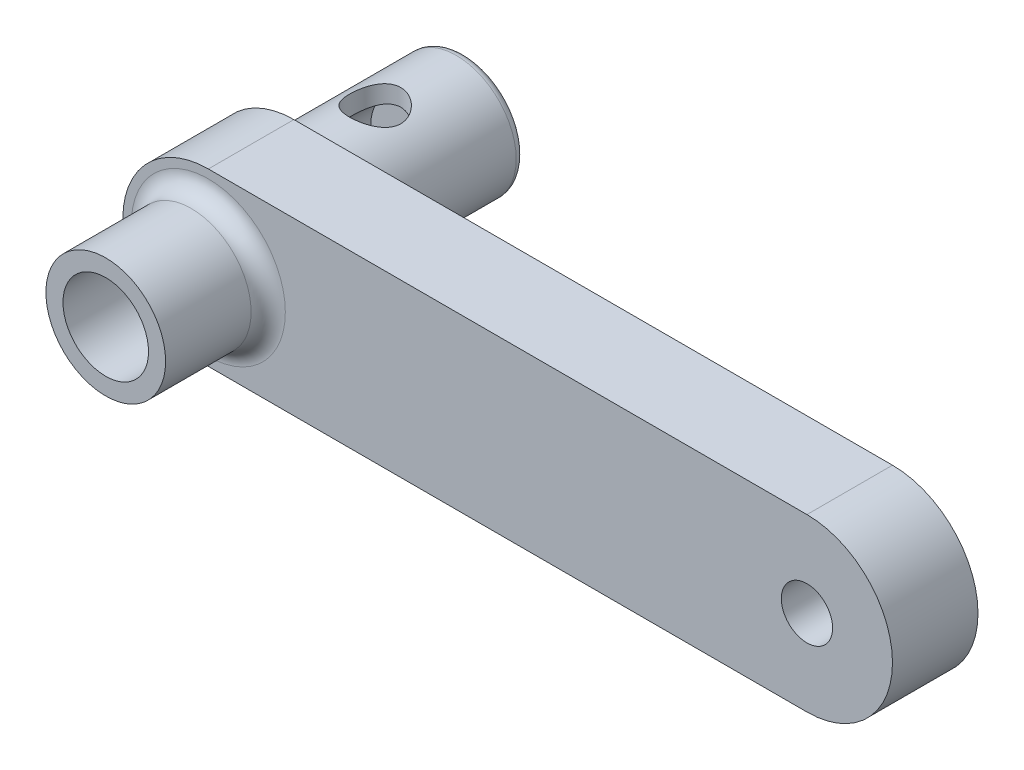
ISO-10303-21;
HEADER;
FILE_DESCRIPTION(('STEP AP214'),'2;1');
FILE_NAME('part.step','',(''),(''),'','','');
FILE_SCHEMA(('AUTOMOTIVE_DESIGN { 1 0 10303 214 1 1 1 1 }'));
ENDSEC;
DATA;
#1=APPLICATION_CONTEXT('core data for automotive mechanical design processes');
#2=APPLICATION_PROTOCOL_DEFINITION('international standard','automotive_design',2000,#1);
#3=PRODUCT_CONTEXT('',#1,'mechanical');
#4=PRODUCT('Part','Part','',(#3));
#5=PRODUCT_RELATED_PRODUCT_CATEGORY('part','',(#4));
#6=PRODUCT_DEFINITION_FORMATION('','',#4);
#7=PRODUCT_DEFINITION_CONTEXT('part definition',#1,'design');
#8=PRODUCT_DEFINITION('design','',#6,#7);
#9=PRODUCT_DEFINITION_SHAPE('','',#8);
#10=(LENGTH_UNIT() NAMED_UNIT(*) SI_UNIT(.MILLI.,.METRE.));
#11=(NAMED_UNIT(*) PLANE_ANGLE_UNIT() SI_UNIT($,.RADIAN.));
#12=(NAMED_UNIT(*) SI_UNIT($,.STERADIAN.) SOLID_ANGLE_UNIT());
#13=UNCERTAINTY_MEASURE_WITH_UNIT(LENGTH_MEASURE(1.E-05),#10,'distance_accuracy_value','');
#14=(GEOMETRIC_REPRESENTATION_CONTEXT(3) GLOBAL_UNCERTAINTY_ASSIGNED_CONTEXT((#13)) GLOBAL_UNIT_ASSIGNED_CONTEXT((#10,
#11,#12)) REPRESENTATION_CONTEXT('',''));
#15=CARTESIAN_POINT('',(0.,0.,0.));
#16=DIRECTION('',(0.,0.,1.));
#17=DIRECTION('',(1.,0.,0.));
#18=AXIS2_PLACEMENT_3D('',#15,#16,#17);
#19=CARTESIAN_POINT('',(-17.5,0.,-0.999999999999999));
#20=DIRECTION('',(0.,0.,1.));
#21=DIRECTION('',(1.,0.,0.));
#22=AXIS2_PLACEMENT_3D('',#19,#20,#21);
#23=TOROIDAL_SURFACE('',#22,4.5,1.);
#24=CARTESIAN_POINT('',(-17.5,0.,0.));
#25=DIRECTION('',(0.,0.,1.));
#26=DIRECTION('',(1.,0.,0.));
#27=AXIS2_PLACEMENT_3D('',#24,#25,#26);
#28=CIRCLE('',#27,4.5);
#29=CARTESIAN_POINT('',(-13.,0.,0.));
#30=VERTEX_POINT('',#29);
#31=EDGE_CURVE('E41',#30,#30,#28,.T.);
#32=ORIENTED_EDGE('',*,*,#31,.F.);
#33=EDGE_LOOP('',(#32));
#34=FACE_BOUND('',#33,.T.);
#35=CARTESIAN_POINT('',(-17.5,0.,-0.999999999999999));
#36=DIRECTION('',(0.,0.,1.));
#37=DIRECTION('',(1.,0.,0.));
#38=AXIS2_PLACEMENT_3D('',#35,#36,#37);
#39=CIRCLE('',#38,3.5);
#40=CARTESIAN_POINT('',(-14.,0.,-0.999999999999999));
#41=VERTEX_POINT('',#40);
#42=EDGE_CURVE('E11',#41,#41,#39,.F.);
#43=ORIENTED_EDGE('',*,*,#42,.F.);
#44=EDGE_LOOP('',(#43));
#45=FACE_BOUND('',#44,.T.);
#46=ADVANCED_FACE('F33',(#34,#45),#23,.F.);
#47=CARTESIAN_POINT('',(-17.5,0.,6.));
#48=DIRECTION('',(0.,0.,1.));
#49=DIRECTION('',(1.,0.,0.));
#50=AXIS2_PLACEMENT_3D('',#47,#48,#49);
#51=TOROIDAL_SURFACE('',#50,4.5,1.);
#52=CARTESIAN_POINT('',(-17.5,0.,6.));
#53=DIRECTION('',(0.,0.,1.));
#54=DIRECTION('',(1.,0.,0.));
#55=AXIS2_PLACEMENT_3D('',#52,#53,#54);
#56=CIRCLE('',#55,3.5);
#57=CARTESIAN_POINT('',(-14.,0.,6.));
#58=VERTEX_POINT('',#57);
#59=EDGE_CURVE('E116',#58,#58,#56,.T.);
#60=ORIENTED_EDGE('',*,*,#59,.F.);
#61=EDGE_LOOP('',(#60));
#62=FACE_BOUND('',#61,.T.);
#63=CARTESIAN_POINT('',(-17.5,0.,5.));
#64=DIRECTION('',(0.,0.,1.));
#65=DIRECTION('',(1.,0.,0.));
#66=AXIS2_PLACEMENT_3D('',#63,#64,#65);
#67=CIRCLE('',#66,4.5);
#68=CARTESIAN_POINT('',(-13.,0.,5.));
#69=VERTEX_POINT('',#68);
#70=EDGE_CURVE('E203',#69,#69,#67,.F.);
#71=ORIENTED_EDGE('',*,*,#70,.F.);
#72=EDGE_LOOP('',(#71));
#73=FACE_BOUND('',#72,.T.);
#74=ADVANCED_FACE('F174',(#62,#73),#51,.F.);
#75=CARTESIAN_POINT('',(-17.5,0.,5.));
#76=DIRECTION('',(0.,0.,1.));
#77=DIRECTION('',(1.,0.,0.));
#78=AXIS2_PLACEMENT_3D('',#75,#76,#77);
#79=PLANE('',#78);
#80=ORIENTED_EDGE('',*,*,#70,.T.);
#81=EDGE_LOOP('',(#80));
#82=FACE_BOUND('',#81,.T.);
#83=CARTESIAN_POINT('',(17.5,0.,5.));
#84=DIRECTION('',(0.,0.,1.));
#85=DIRECTION('',(1.,0.,0.));
#86=AXIS2_PLACEMENT_3D('',#83,#84,#85);
#87=CIRCLE('',#86,1.5);
#88=CARTESIAN_POINT('',(19.,0.,5.));
#89=VERTEX_POINT('',#88);
#90=EDGE_CURVE('E103',#89,#89,#87,.T.);
#91=ORIENTED_EDGE('',*,*,#90,.F.);
#92=EDGE_LOOP('',(#91));
#93=FACE_BOUND('',#92,.T.);
#94=CARTESIAN_POINT('',(-17.5,0.,5.));
#95=DIRECTION('',(0.,0.,1.));
#96=DIRECTION('',(1.,0.,0.));
#97=AXIS2_PLACEMENT_3D('',#94,#95,#96);
#98=CIRCLE('',#97,5.);
#99=CARTESIAN_POINT('',(-17.5,5.,5.));
#100=VERTEX_POINT('',#99);
#101=CARTESIAN_POINT('',(-17.5,-5.,5.));
#102=VERTEX_POINT('',#101);
#103=EDGE_CURVE('E85',#100,#102,#98,.T.);
#104=ORIENTED_EDGE('',*,*,#103,.T.);
#105=DIRECTION('',(1.,0.,0.));
#106=VECTOR('',#105,1.);
#107=CARTESIAN_POINT('',(-17.5,-5.,5.));
#108=LINE('',#107,#106);
#109=CARTESIAN_POINT('',(17.5,-5.,5.));
#110=VERTEX_POINT('',#109);
#111=EDGE_CURVE('E80',#102,#110,#108,.T.);
#112=ORIENTED_EDGE('',*,*,#111,.T.);
#113=CARTESIAN_POINT('',(17.5,0.,5.));
#114=DIRECTION('',(0.,0.,1.));
#115=DIRECTION('',(1.,0.,0.));
#116=AXIS2_PLACEMENT_3D('',#113,#114,#115);
#117=CIRCLE('',#116,5.);
#118=CARTESIAN_POINT('',(17.5,5.00000000000001,5.));
#119=VERTEX_POINT('',#118);
#120=EDGE_CURVE('E83',#110,#119,#117,.T.);
#121=ORIENTED_EDGE('',*,*,#120,.T.);
#122=DIRECTION('',(-1.,0.,0.));
#123=VECTOR('',#122,1.);
#124=CARTESIAN_POINT('',(-17.5,5.,5.));
#125=LINE('',#124,#123);
#126=EDGE_CURVE('E49',#119,#100,#125,.T.);
#127=ORIENTED_EDGE('',*,*,#126,.T.);
#128=EDGE_LOOP('',(#104,#112,#121,#127));
#129=FACE_BOUND('',#128,.T.);
#130=ADVANCED_FACE('F81',(#82,#93,#129),#79,.T.);
#131=CARTESIAN_POINT('',(-17.5,0.,5.));
#132=DIRECTION('',(0.,0.,-1.));
#133=DIRECTION('',(-1.,0.,0.));
#134=AXIS2_PLACEMENT_3D('',#131,#132,#133);
#135=CYLINDRICAL_SURFACE('',#134,2.5);
#136=CARTESIAN_POINT('',(-17.5,-2.5,-3.25));
#137=CARTESIAN_POINT('',(-17.423270166538,-2.49999625789732,-3.25000409100988));
#138=CARTESIAN_POINT('',(-17.3464176793558,-2.4964290461501,-3.25592867092626));
#139=CARTESIAN_POINT('',(-17.1950244904693,-2.48249903608568,-3.27932431951533));
#140=CARTESIAN_POINT('',(-17.120489965404,-2.47211948032719,-3.29682386185422));
#141=CARTESIAN_POINT('',(-16.9762481722092,-2.44561558054488,-3.34238636116686));
#142=CARTESIAN_POINT('',(-16.9065189717734,-2.42951973272944,-3.37039695816316));
#143=CARTESIAN_POINT('',(-16.7729696817853,-2.39295367626407,-3.43586033314103));
#144=CARTESIAN_POINT('',(-16.7091481305836,-2.37248455380255,-3.47331076696875));
#145=CARTESIAN_POINT('',(-16.5837007210007,-2.32705360719088,-3.55977482670858));
#146=CARTESIAN_POINT('',(-16.5226159799186,-2.30186792195985,-3.60945369535139));
#147=CARTESIAN_POINT('',(-16.4091172958811,-2.25030439279634,-3.71746720382827));
#148=CARTESIAN_POINT('',(-16.3567146505189,-2.22392505153571,-3.77581293718732));
#149=CARTESIAN_POINT('',(-16.2555500323703,-2.1691106699591,-3.90792351049673));
#150=CARTESIAN_POINT('',(-16.2080223362119,-2.14082017703649,-3.98270177098129));
#151=CARTESIAN_POINT('',(-16.126385622351,-2.08938301412124,-4.14084657324311));
#152=CARTESIAN_POINT('',(-16.0922548266484,-2.06622802273937,-4.22419889624757));
#153=CARTESIAN_POINT('',(-16.0455939828578,-2.0335462966093,-4.37659645065324));
#154=CARTESIAN_POINT('',(-16.0298380275317,-2.02207883137591,-4.44423599861032));
#155=CARTESIAN_POINT('',(-16.0078382765953,-2.00590308295503,-4.58180371583036));
#156=CARTESIAN_POINT('',(-16.0015826544316,-2.00118639643759,-4.65172892875449));
#157=CARTESIAN_POINT('',(-15.9989449120399,-1.99920922463856,-4.79201149421733));
#158=CARTESIAN_POINT('',(-16.0025821659158,-2.00196337012718,-4.8623694250932));
#159=CARTESIAN_POINT('',(-16.0195393952117,-2.01453261443741,-5.00127877542759));
#160=CARTESIAN_POINT('',(-16.032866653799,-2.02435302432226,-5.06982879584744));
#161=CARTESIAN_POINT('',(-16.0682607811821,-2.04953186944258,-5.2025302421281));
#162=CARTESIAN_POINT('',(-16.0902125133391,-2.06481711652537,-5.26672705392448));
#163=CARTESIAN_POINT('',(-16.1420493822916,-2.09927051350828,-5.39069499092812));
#164=CARTESIAN_POINT('',(-16.171937427403,-2.11844008623465,-5.45046448342392));
#165=CARTESIAN_POINT('',(-16.2448201681542,-2.16255327268985,-5.5749840971228));
#166=CARTESIAN_POINT('',(-16.2891927560228,-2.18792043372992,-5.63877809295493));
#167=CARTESIAN_POINT('',(-16.38708907216,-2.23930599764381,-5.75867648366702));
#168=CARTESIAN_POINT('',(-16.4406215489942,-2.26532500262149,-5.8147734339765));
#169=CARTESIAN_POINT('',(-16.564188165617,-2.31935504958317,-5.92561298182176));
#170=CARTESIAN_POINT('',(-16.635482317295,-2.34713836268532,-5.97907730601599));
#171=CARTESIAN_POINT('',(-16.787723949541,-2.39772428433981,-6.07312204719791));
#172=CARTESIAN_POINT('',(-16.8686662360564,-2.42052955425515,-6.11370935378995));
#173=CARTESIAN_POINT('',(-17.0328024147318,-2.45730392066151,-6.1779321827959));
#174=CARTESIAN_POINT('',(-17.1155323758264,-2.47173957439704,-6.20247535571591));
#175=CARTESIAN_POINT('',(-17.2849521048554,-2.49218842813551,-6.23701119740538));
#176=CARTESIAN_POINT('',(-17.3716369943387,-2.49821172952738,-6.24702131775358));
#177=CARTESIAN_POINT('',(-17.5337146143774,-2.5009057037461,-6.25150784767831));
#178=CARTESIAN_POINT('',(-17.6090424734187,-2.49873521714286,-6.24790885508517));
#179=CARTESIAN_POINT('',(-17.7578294019861,-2.48778712087048,-6.22957414692808));
#180=CARTESIAN_POINT('',(-17.8312885093761,-2.47900964518037,-6.21483865719419));
#181=CARTESIAN_POINT('',(-17.9725749321576,-2.4559479244219,-6.17545656718754));
#182=CARTESIAN_POINT('',(-18.0404957509285,-2.44180275662555,-6.15105965092653));
#183=CARTESIAN_POINT('',(-18.1712657490873,-2.40913880862845,-6.09332262363473));
#184=CARTESIAN_POINT('',(-18.2341139249639,-2.39061916586511,-6.05998074865333));
#185=CARTESIAN_POINT('',(-18.3600062628239,-2.3484549623736,-5.9814430207913));
#186=CARTESIAN_POINT('',(-18.4223941504568,-2.3244780273988,-5.93537617092161));
#187=CARTESIAN_POINT('',(-18.5390260313101,-2.27474265574732,-5.83460860651138));
#188=CARTESIAN_POINT('',(-18.5932604027374,-2.2489821658636,-5.77989784514747));
#189=CARTESIAN_POINT('',(-18.6993199673558,-2.19445423909891,-5.65508960996285));
#190=CARTESIAN_POINT('',(-18.7499101963092,-2.16573241746291,-5.5839161145345));
#191=CARTESIAN_POINT('',(-18.8384523891567,-2.1121618206671,-5.4327839754318));
#192=CARTESIAN_POINT('',(-18.8764176676978,-2.0873089799769,-5.35283470610722));
#193=CARTESIAN_POINT('',(-18.9314257879578,-2.04984909240519,-5.20375697769331));
#194=CARTESIAN_POINT('',(-18.9512162533619,-2.03575659328728,-5.13601968764141));
#195=CARTESIAN_POINT('',(-18.9811366390597,-2.01409605743544,-4.9974679219199));
#196=CARTESIAN_POINT('',(-18.9912799529763,-2.00651897642721,-4.92665785567217));
#197=CARTESIAN_POINT('',(-19.0013413041663,-1.99900446616267,-4.78362305240297));
#198=CARTESIAN_POINT('',(-19.0012208910787,-1.99909576445937,-4.71139400931296));
#199=CARTESIAN_POINT('',(-18.9906647295933,-2.0069771789285,-4.56810556439054));
#200=CARTESIAN_POINT('',(-18.9802233721576,-2.0147714813882,-4.49704681991941));
#201=CARTESIAN_POINT('',(-18.9504017414891,-2.0363318524298,-4.36151158242782));
#202=CARTESIAN_POINT('',(-18.9314763684535,-2.0497921180558,-4.29688290569313));
#203=CARTESIAN_POINT('',(-18.8856324207699,-2.08105501960151,-4.17166274552579));
#204=CARTESIAN_POINT('',(-18.8587108358848,-2.09885929040482,-4.11107279303945));
#205=CARTESIAN_POINT('',(-18.7928924555573,-2.14012990550916,-3.98568014277922));
#206=CARTESIAN_POINT('',(-18.7527916767575,-2.16404587582639,-3.92165889614569));
#207=CARTESIAN_POINT('',(-18.6637569838908,-2.21320127030768,-3.80061992738271));
#208=CARTESIAN_POINT('',(-18.614815796078,-2.23844177205021,-3.74360803784744));
#209=CARTESIAN_POINT('',(-18.5000977742573,-2.29225690291476,-3.62864905086833));
#210=CARTESIAN_POINT('',(-18.4328768193139,-2.32070308663658,-3.57206892510381));
#211=CARTESIAN_POINT('',(-18.2884624344456,-2.37365428872367,-3.47090214413669));
#212=CARTESIAN_POINT('',(-18.2112654445015,-2.39815789310936,-3.42631978801521));
#213=CARTESIAN_POINT('',(-18.0511252308015,-2.43985578654394,-3.35221419242626));
#214=CARTESIAN_POINT('',(-17.9684300869572,-2.45725077479787,-3.32227193507317));
#215=CARTESIAN_POINT('',(-17.7979733061188,-2.48366273001246,-3.27727530478902));
#216=CARTESIAN_POINT('',(-17.7102320996486,-2.49271125871485,-3.26216483214301));
#217=CARTESIAN_POINT('',(-17.6015580969175,-2.49802001168187,-3.25330254529134));
#218=CARTESIAN_POINT('',(-17.5812762590283,-2.49876114656362,-3.2520655826939));
#219=CARTESIAN_POINT('',(-17.5406658206871,-2.49975164517367,-3.25041375362914));
#220=CARTESIAN_POINT('',(-17.5203372186376,-2.50000099184316,-3.2499989156791));
#221=CARTESIAN_POINT('',(-17.5,-2.5,-3.25));
#222=B_SPLINE_CURVE_WITH_KNOTS('',3,(#136,#137,#138,#139,#140,#141,#142,#143,#144,#145,#146,
#147,#148,#149,#150,#151,#152,#153,#154,#155,#156,#157,#158,#159,#160,#161,#162,#163,#164,#165,
#166,#167,#168,#169,#170,#171,#172,#173,#174,#175,#176,#177,#178,#179,#180,#181,#182,#183,#184,
#185,#186,#187,#188,#189,#190,#191,#192,#193,#194,#195,#196,#197,#198,#199,#200,#201,#202,#203,
#204,#205,#206,#207,#208,#209,#210,#211,#212,#213,#214,#215,#216,#217,#218,#219,#220,#221),
.UNSPECIFIED.,.T.,.F.,(4,2,2,2,2,2,2,2,2,2,2,2,2,2,2,2,2,2,2,2,2,2,2,2,2,2,2,2,2,2,2,2,2,2,2,2,
2,2,2,2,2,2,4),(0.,0.23010223754865,0.460772627520013,0.690308884600013,0.919788197992274,
1.16681590732472,1.41416257934801,1.69183813189807,1.96906040692092,2.17933829855633,
2.38935420916578,2.59978170870726,2.81036753273872,3.01823267593207,3.22617409809868,
3.47046995225163,3.71500044803674,3.99360957884691,4.27206939275324,4.53296790696559,
4.79355286918236,5.01875602722426,5.24395461863455,5.46367785689772,5.68344445659025,
5.92601365818362,6.16886690081836,6.44336762428009,6.71757792616456,6.93257787314692,
7.14727888733318,7.36278425777433,7.57840681155725,7.78364098331141,7.98895251523034,
8.22578610052286,8.46281544370207,8.73854311775518,9.01436946031984,9.28175654462677,
9.54812832184448,9.60911473335176,9.6701032602764),.UNSPECIFIED.);
#223=CARTESIAN_POINT('',(-17.5,-2.5,-3.25));
#224=VERTEX_POINT('',#223);
#225=EDGE_CURVE('E158',#224,#224,#222,.T.);
#226=ORIENTED_EDGE('',*,*,#225,.F.);
#227=EDGE_LOOP('',(#226));
#228=FACE_BOUND('',#227,.T.);
#229=CARTESIAN_POINT('',(-17.5,2.5,-3.25));
#230=CARTESIAN_POINT('',(-17.576729833462,2.49999625789732,-3.25000409100988));
#231=CARTESIAN_POINT('',(-17.6535823206442,2.4964290461501,-3.25592867092626));
#232=CARTESIAN_POINT('',(-17.8049755095307,2.48249903608568,-3.27932431951533));
#233=CARTESIAN_POINT('',(-17.879510034596,2.47211948032719,-3.29682386185422));
#234=CARTESIAN_POINT('',(-18.0237518277908,2.44561558054488,-3.34238636116686));
#235=CARTESIAN_POINT('',(-18.0934810282266,2.42951973272944,-3.37039695816316));
#236=CARTESIAN_POINT('',(-18.2270303182147,2.39295367626407,-3.43586033314103));
#237=CARTESIAN_POINT('',(-18.2908518694164,2.37248455380255,-3.47331076696875));
#238=CARTESIAN_POINT('',(-18.4162992789993,2.32705360719088,-3.55977482670858));
#239=CARTESIAN_POINT('',(-18.4773840200814,2.30186792195985,-3.60945369535139));
#240=CARTESIAN_POINT('',(-18.5908827041189,2.25030439279634,-3.71746720382827));
#241=CARTESIAN_POINT('',(-18.6432853494811,2.22392505153571,-3.77581293718732));
#242=CARTESIAN_POINT('',(-18.7444499676297,2.1691106699591,-3.90792351049673));
#243=CARTESIAN_POINT('',(-18.7919776637881,2.14082017703649,-3.98270177098129));
#244=CARTESIAN_POINT('',(-18.873614377649,2.08938301412124,-4.14084657324311));
#245=CARTESIAN_POINT('',(-18.9077451733516,2.06622802273937,-4.22419889624757));
#246=CARTESIAN_POINT('',(-18.9544060171422,2.0335462966093,-4.37659645065324));
#247=CARTESIAN_POINT('',(-18.9701619724683,2.02207883137591,-4.44423599861032));
#248=CARTESIAN_POINT('',(-18.9921617234047,2.00590308295503,-4.58180371583036));
#249=CARTESIAN_POINT('',(-18.9984173455684,2.00118639643759,-4.65172892875449));
#250=CARTESIAN_POINT('',(-19.0010550879601,1.99920922463856,-4.79201149421733));
#251=CARTESIAN_POINT('',(-18.9974178340842,2.00196337012718,-4.8623694250932));
#252=CARTESIAN_POINT('',(-18.9804606047883,2.01453261443741,-5.00127877542759));
#253=CARTESIAN_POINT('',(-18.967133346201,2.02435302432226,-5.06982879584744));
#254=CARTESIAN_POINT('',(-18.9317392188179,2.04953186944258,-5.2025302421281));
#255=CARTESIAN_POINT('',(-18.9097874866609,2.06481711652537,-5.26672705392448));
#256=CARTESIAN_POINT('',(-18.8579506177084,2.09927051350828,-5.39069499092812));
#257=CARTESIAN_POINT('',(-18.828062572597,2.11844008623465,-5.45046448342392));
#258=CARTESIAN_POINT('',(-18.7551798318458,2.16255327268985,-5.5749840971228));
#259=CARTESIAN_POINT('',(-18.7108072439772,2.18792043372992,-5.63877809295493));
#260=CARTESIAN_POINT('',(-18.61291092784,2.23930599764381,-5.75867648366702));
#261=CARTESIAN_POINT('',(-18.5593784510058,2.26532500262149,-5.8147734339765));
#262=CARTESIAN_POINT('',(-18.435811834383,2.31935504958317,-5.92561298182176));
#263=CARTESIAN_POINT('',(-18.364517682705,2.34713836268532,-5.97907730601599));
#264=CARTESIAN_POINT('',(-18.212276050459,2.3977242843398,-6.07312204719791));
#265=CARTESIAN_POINT('',(-18.1313337639436,2.42052955425515,-6.11370935378995));
#266=CARTESIAN_POINT('',(-17.9671975852682,2.45730392066151,-6.1779321827959));
#267=CARTESIAN_POINT('',(-17.8844676241736,2.47173957439704,-6.20247535571591));
#268=CARTESIAN_POINT('',(-17.7150478951446,2.49218842813551,-6.23701119740538));
#269=CARTESIAN_POINT('',(-17.6283630056613,2.49821172952738,-6.24702131775358));
#270=CARTESIAN_POINT('',(-17.4662853856226,2.5009057037461,-6.25150784767831));
#271=CARTESIAN_POINT('',(-17.3909575265813,2.49873521714286,-6.24790885508517));
#272=CARTESIAN_POINT('',(-17.2421705980139,2.48778712087048,-6.22957414692808));
#273=CARTESIAN_POINT('',(-17.1687114906239,2.47900964518037,-6.21483865719419));
#274=CARTESIAN_POINT('',(-17.0274250678424,2.4559479244219,-6.17545656718754));
#275=CARTESIAN_POINT('',(-16.9595042490715,2.44180275662555,-6.15105965092653));
#276=CARTESIAN_POINT('',(-16.8287342509127,2.40913880862845,-6.09332262363473));
#277=CARTESIAN_POINT('',(-16.7658860750361,2.39061916586511,-6.05998074865333));
#278=CARTESIAN_POINT('',(-16.6399937371761,2.3484549623736,-5.9814430207913));
#279=CARTESIAN_POINT('',(-16.5776058495432,2.3244780273988,-5.93537617092161));
#280=CARTESIAN_POINT('',(-16.4609739686899,2.27474265574732,-5.83460860651138));
#281=CARTESIAN_POINT('',(-16.4067395972626,2.2489821658636,-5.77989784514747));
#282=CARTESIAN_POINT('',(-16.3006800326442,2.19445423909891,-5.65508960996285));
#283=CARTESIAN_POINT('',(-16.2500898036909,2.16573241746291,-5.5839161145345));
#284=CARTESIAN_POINT('',(-16.1615476108433,2.1121618206671,-5.4327839754318));
#285=CARTESIAN_POINT('',(-16.1235823323022,2.0873089799769,-5.35283470610722));
#286=CARTESIAN_POINT('',(-16.0685742120422,2.04984909240519,-5.20375697769331));
#287=CARTESIAN_POINT('',(-16.0487837466381,2.03575659328728,-5.13601968764141));
#288=CARTESIAN_POINT('',(-16.0188633609403,2.01409605743544,-4.9974679219199));
#289=CARTESIAN_POINT('',(-16.0087200470237,2.00651897642721,-4.92665785567217));
#290=CARTESIAN_POINT('',(-15.9986586958337,1.99900446616267,-4.78362305240297));
#291=CARTESIAN_POINT('',(-15.9987791089213,1.99909576445937,-4.71139400931296));
#292=CARTESIAN_POINT('',(-16.0093352704067,2.0069771789285,-4.56810556439054));
#293=CARTESIAN_POINT('',(-16.0197766278424,2.0147714813882,-4.49704681991941));
#294=CARTESIAN_POINT('',(-16.0495982585109,2.0363318524298,-4.36151158242782));
#295=CARTESIAN_POINT('',(-16.0685236315465,2.0497921180558,-4.29688290569313));
#296=CARTESIAN_POINT('',(-16.1143675792301,2.08105501960151,-4.17166274552579));
#297=CARTESIAN_POINT('',(-16.1412891641152,2.09885929040482,-4.11107279303945));
#298=CARTESIAN_POINT('',(-16.2071075444427,2.14012990550916,-3.98568014277922));
#299=CARTESIAN_POINT('',(-16.2472083232425,2.16404587582639,-3.92165889614569));
#300=CARTESIAN_POINT('',(-16.3362430161092,2.21320127030768,-3.80061992738271));
#301=CARTESIAN_POINT('',(-16.385184203922,2.23844177205021,-3.74360803784745));
#302=CARTESIAN_POINT('',(-16.4999022257427,2.29225690291476,-3.62864905086833));
#303=CARTESIAN_POINT('',(-16.5671231806861,2.32070308663658,-3.57206892510381));
#304=CARTESIAN_POINT('',(-16.7115375655544,2.37365428872367,-3.47090214413669));
#305=CARTESIAN_POINT('',(-16.7887345554985,2.39815789310936,-3.42631978801521));
#306=CARTESIAN_POINT('',(-16.9488747691985,2.43985578654394,-3.35221419242626));
#307=CARTESIAN_POINT('',(-17.0315699130428,2.45725077479786,-3.32227193507317));
#308=CARTESIAN_POINT('',(-17.2020266938812,2.48366273001246,-3.27727530478903));
#309=CARTESIAN_POINT('',(-17.2897679003514,2.49271125871485,-3.26216483214301));
#310=CARTESIAN_POINT('',(-17.3984419030825,2.49802001168187,-3.25330254529134));
#311=CARTESIAN_POINT('',(-17.4187237409717,2.49876114656362,-3.2520655826939));
#312=CARTESIAN_POINT('',(-17.4593341793129,2.49975164517367,-3.25041375362914));
#313=CARTESIAN_POINT('',(-17.4796627813624,2.50000099184316,-3.2499989156791));
#314=CARTESIAN_POINT('',(-17.5,2.5,-3.25));
#315=B_SPLINE_CURVE_WITH_KNOTS('',3,(#229,#230,#231,#232,#233,#234,#235,#236,#237,#238,#239,
#240,#241,#242,#243,#244,#245,#246,#247,#248,#249,#250,#251,#252,#253,#254,#255,#256,#257,#258,
#259,#260,#261,#262,#263,#264,#265,#266,#267,#268,#269,#270,#271,#272,#273,#274,#275,#276,#277,
#278,#279,#280,#281,#282,#283,#284,#285,#286,#287,#288,#289,#290,#291,#292,#293,#294,#295,#296,
#297,#298,#299,#300,#301,#302,#303,#304,#305,#306,#307,#308,#309,#310,#311,#312,#313,#314),
.UNSPECIFIED.,.T.,.F.,(4,2,2,2,2,2,2,2,2,2,2,2,2,2,2,2,2,2,2,2,2,2,2,2,2,2,2,2,2,2,2,2,2,2,2,2,
2,2,2,2,2,2,4),(0.,0.230102237548647,0.460772627520013,0.690308884600013,0.919788197992274,
1.16681590732472,1.41416257934801,1.69183813189807,1.96906040692092,2.17933829855633,
2.38935420916578,2.59978170870726,2.81036753273872,3.01823267593207,3.22617409809868,
3.47046995225163,3.71500044803674,3.99360957884691,4.27206939275324,4.53296790696559,
4.79355286918236,5.01875602722426,5.24395461863455,5.46367785689772,5.68344445659025,
5.92601365818362,6.16886690081836,6.44336762428009,6.71757792616456,6.93257787314692,
7.14727888733318,7.36278425777433,7.57840681155725,7.78364098331141,7.98895251523034,
8.22578610052285,8.46281544370207,8.73854311775518,9.01436946031984,9.28175654462676,
9.54812832184448,9.60911473335177,9.6701032602764),.UNSPECIFIED.);
#316=CARTESIAN_POINT('',(-17.5,2.5,-3.25));
#317=VERTEX_POINT('',#316);
#318=EDGE_CURVE('E151',#317,#317,#315,.T.);
#319=ORIENTED_EDGE('',*,*,#318,.F.);
#320=EDGE_LOOP('',(#319));
#321=FACE_BOUND('',#320,.T.);
#322=CARTESIAN_POINT('',(-17.5,0.,-7.));
#323=DIRECTION('',(0.,0.,-1.));
#324=DIRECTION('',(-1.,0.,0.));
#325=AXIS2_PLACEMENT_3D('',#322,#323,#324);
#326=CIRCLE('',#325,2.5);
#327=CARTESIAN_POINT('',(-20.,0.,-7.));
#328=VERTEX_POINT('',#327);
#329=EDGE_CURVE('E258',#328,#328,#326,.T.);
#330=ORIENTED_EDGE('',*,*,#329,.T.);
#331=EDGE_LOOP('',(#330));
#332=FACE_BOUND('',#331,.T.);
#333=CARTESIAN_POINT('',(-17.5,0.,11.));
#334=DIRECTION('',(0.,0.,1.));
#335=DIRECTION('',(1.,0.,0.));
#336=AXIS2_PLACEMENT_3D('',#333,#334,#335);
#337=CIRCLE('',#336,2.5);
#338=CARTESIAN_POINT('',(-15.,0.,11.));
#339=VERTEX_POINT('',#338);
#340=EDGE_CURVE('E213',#339,#339,#337,.T.);
#341=ORIENTED_EDGE('',*,*,#340,.T.);
#342=EDGE_LOOP('',(#341));
#343=FACE_BOUND('',#342,.T.);
#344=ADVANCED_FACE('F164',(#228,#321,#332,#343),#135,.F.);
#345=CARTESIAN_POINT('',(-17.5,0.,0.));
#346=DIRECTION('',(0.,0.,1.));
#347=DIRECTION('',(1.,0.,0.));
#348=AXIS2_PLACEMENT_3D('',#345,#346,#347);
#349=PLANE('',#348);
#350=ORIENTED_EDGE('',*,*,#31,.T.);
#351=EDGE_LOOP('',(#350));
#352=FACE_BOUND('',#351,.T.);
#353=CARTESIAN_POINT('',(-17.5,0.,0.));
#354=DIRECTION('',(0.,0.,1.));
#355=DIRECTION('',(1.,0.,0.));
#356=AXIS2_PLACEMENT_3D('',#353,#354,#355);
#357=CIRCLE('',#356,5.);
#358=CARTESIAN_POINT('',(-17.5,5.,0.));
#359=VERTEX_POINT('',#358);
#360=CARTESIAN_POINT('',(-17.5,-5.,0.));
#361=VERTEX_POINT('',#360);
#362=EDGE_CURVE('E100',#359,#361,#357,.T.);
#363=ORIENTED_EDGE('',*,*,#362,.F.);
#364=DIRECTION('',(-1.,0.,0.));
#365=VECTOR('',#364,1.);
#366=CARTESIAN_POINT('',(-17.5,5.,0.));
#367=LINE('',#366,#365);
#368=CARTESIAN_POINT('',(17.5,5.00000000000001,0.));
#369=VERTEX_POINT('',#368);
#370=EDGE_CURVE('E72',#369,#359,#367,.T.);
#371=ORIENTED_EDGE('',*,*,#370,.F.);
#372=CARTESIAN_POINT('',(17.5,0.,0.));
#373=DIRECTION('',(0.,0.,1.));
#374=DIRECTION('',(1.,0.,0.));
#375=AXIS2_PLACEMENT_3D('',#372,#373,#374);
#376=CIRCLE('',#375,5.);
#377=CARTESIAN_POINT('',(17.5,-5.,0.));
#378=VERTEX_POINT('',#377);
#379=EDGE_CURVE('E66',#378,#369,#376,.T.);
#380=ORIENTED_EDGE('',*,*,#379,.F.);
#381=DIRECTION('',(1.,0.,0.));
#382=VECTOR('',#381,1.);
#383=CARTESIAN_POINT('',(-17.5,-5.,0.));
#384=LINE('',#383,#382);
#385=EDGE_CURVE('E90',#361,#378,#384,.T.);
#386=ORIENTED_EDGE('',*,*,#385,.F.);
#387=EDGE_LOOP('',(#363,#371,#380,#386));
#388=FACE_BOUND('',#387,.T.);
#389=CARTESIAN_POINT('',(17.5,0.,0.));
#390=DIRECTION('',(0.,0.,1.));
#391=DIRECTION('',(1.,0.,0.));
#392=AXIS2_PLACEMENT_3D('',#389,#390,#391);
#393=CIRCLE('',#392,1.5);
#394=CARTESIAN_POINT('',(19.,0.,0.));
#395=VERTEX_POINT('',#394);
#396=EDGE_CURVE('E256',#395,#395,#393,.T.);
#397=ORIENTED_EDGE('',*,*,#396,.T.);
#398=EDGE_LOOP('',(#397));
#399=FACE_BOUND('',#398,.T.);
#400=ADVANCED_FACE('F168',(#352,#388,#399),#349,.F.);
#401=CARTESIAN_POINT('',(-17.5,0.,5.));
#402=DIRECTION('',(0.,0.,-1.));
#403=DIRECTION('',(-1.,0.,0.));
#404=AXIS2_PLACEMENT_3D('',#401,#402,#403);
#405=CYLINDRICAL_SURFACE('',#404,5.);
#406=ORIENTED_EDGE('',*,*,#362,.T.);
#407=DIRECTION('',(0.,0.,-1.));
#408=VECTOR('',#407,1.);
#409=CARTESIAN_POINT('',(-17.5,-5.,5.));
#410=LINE('',#409,#408);
#411=EDGE_CURVE('E91',#102,#361,#410,.T.);
#412=ORIENTED_EDGE('',*,*,#411,.F.);
#413=ORIENTED_EDGE('',*,*,#103,.F.);
#414=DIRECTION('',(0.,0.,-1.));
#415=VECTOR('',#414,1.);
#416=CARTESIAN_POINT('',(-17.5,5.,5.));
#417=LINE('',#416,#415);
#418=EDGE_CURVE('E96',#100,#359,#417,.T.);
#419=ORIENTED_EDGE('',*,*,#418,.T.);
#420=EDGE_LOOP('',(#406,#412,#413,#419));
#421=FACE_BOUND('',#420,.T.);
#422=ADVANCED_FACE('F178',(#421),#405,.T.);
#423=CARTESIAN_POINT('',(-17.5,-5.,5.));
#424=DIRECTION('',(0.,1.,0.));
#425=DIRECTION('',(-1.,0.,0.));
#426=AXIS2_PLACEMENT_3D('',#423,#424,#425);
#427=PLANE('',#426);
#428=ORIENTED_EDGE('',*,*,#385,.T.);
#429=DIRECTION('',(0.,0.,-1.));
#430=VECTOR('',#429,1.);
#431=CARTESIAN_POINT('',(17.5,-5.,5.));
#432=LINE('',#431,#430);
#433=EDGE_CURVE('E88',#110,#378,#432,.T.);
#434=ORIENTED_EDGE('',*,*,#433,.F.);
#435=ORIENTED_EDGE('',*,*,#111,.F.);
#436=ORIENTED_EDGE('',*,*,#411,.T.);
#437=EDGE_LOOP('',(#428,#434,#435,#436));
#438=FACE_BOUND('',#437,.T.);
#439=ADVANCED_FACE('F89',(#438),#427,.F.);
#440=CARTESIAN_POINT('',(17.5,0.,5.));
#441=DIRECTION('',(0.,0.,-1.));
#442=DIRECTION('',(-1.,0.,0.));
#443=AXIS2_PLACEMENT_3D('',#440,#441,#442);
#444=CYLINDRICAL_SURFACE('',#443,5.);
#445=ORIENTED_EDGE('',*,*,#379,.T.);
#446=DIRECTION('',(0.,0.,-1.));
#447=VECTOR('',#446,1.);
#448=CARTESIAN_POINT('',(17.5,5.00000000000001,5.));
#449=LINE('',#448,#447);
#450=EDGE_CURVE('E92',#119,#369,#449,.T.);
#451=ORIENTED_EDGE('',*,*,#450,.F.);
#452=ORIENTED_EDGE('',*,*,#120,.F.);
#453=ORIENTED_EDGE('',*,*,#433,.T.);
#454=EDGE_LOOP('',(#445,#451,#452,#453));
#455=FACE_BOUND('',#454,.T.);
#456=ADVANCED_FACE('F94',(#455),#444,.T.);
#457=CARTESIAN_POINT('',(-17.5,5.,5.));
#458=DIRECTION('',(0.,-1.,0.));
#459=DIRECTION('',(1.,0.,0.));
#460=AXIS2_PLACEMENT_3D('',#457,#458,#459);
#461=PLANE('',#460);
#462=ORIENTED_EDGE('',*,*,#370,.T.);
#463=ORIENTED_EDGE('',*,*,#418,.F.);
#464=ORIENTED_EDGE('',*,*,#126,.F.);
#465=ORIENTED_EDGE('',*,*,#450,.T.);
#466=EDGE_LOOP('',(#462,#463,#464,#465));
#467=FACE_BOUND('',#466,.T.);
#468=ADVANCED_FACE('F180',(#467),#461,.F.);
#469=CARTESIAN_POINT('',(17.5,0.,5.));
#470=DIRECTION('',(0.,0.,-1.));
#471=DIRECTION('',(-1.,0.,0.));
#472=AXIS2_PLACEMENT_3D('',#469,#470,#471);
#473=CYLINDRICAL_SURFACE('',#472,1.5);
#474=ORIENTED_EDGE('',*,*,#90,.T.);
#475=EDGE_LOOP('',(#474));
#476=FACE_BOUND('',#475,.T.);
#477=ORIENTED_EDGE('',*,*,#396,.F.);
#478=EDGE_LOOP('',(#477));
#479=FACE_BOUND('',#478,.T.);
#480=ADVANCED_FACE('F170',(#476,#479),#473,.F.);
#481=CARTESIAN_POINT('',(-17.5,0.,-10.));
#482=DIRECTION('',(0.,0.,1.));
#483=DIRECTION('',(1.,0.,0.));
#484=AXIS2_PLACEMENT_3D('',#481,#482,#483);
#485=CYLINDRICAL_SURFACE('',#484,3.5);
#486=ORIENTED_EDGE('',*,*,#42,.T.);
#487=EDGE_LOOP('',(#486));
#488=FACE_BOUND('',#487,.T.);
#489=CARTESIAN_POINT('',(-17.5,-3.5,-3.25));
#490=CARTESIAN_POINT('',(-17.5801521976824,-3.49999299268885,-3.25000922143898));
#491=CARTESIAN_POINT('',(-17.6604199921982,-3.4972151640971,-3.2564621297556));
#492=CARTESIAN_POINT('',(-17.8186716113612,-3.48637069204866,-3.28203970728538));
#493=CARTESIAN_POINT('',(-17.8966491490906,-3.47829069608751,-3.30119636978955));
#494=CARTESIAN_POINT('',(-18.0477681647464,-3.45770786336707,-3.35133527519898));
#495=CARTESIAN_POINT('',(-18.1209253861467,-3.44522036823866,-3.38227652746265));
#496=CARTESIAN_POINT('',(-18.2609364460719,-3.4170283792682,-3.45493210375048));
#497=CARTESIAN_POINT('',(-18.3277919856114,-3.40132475720839,-3.49664350915098));
#498=CARTESIAN_POINT('',(-18.4569207835461,-3.36733908702934,-3.59196385412533));
#499=CARTESIAN_POINT('',(-18.5188202442525,-3.34896947381213,-3.64604763807763));
#500=CARTESIAN_POINT('',(-18.6329951843693,-3.3120882776969,-3.76357192611614));
#501=CARTESIAN_POINT('',(-18.6852653205566,-3.29357662187922,-3.82701759007028));
#502=CARTESIAN_POINT('',(-18.7814284354819,-3.25741027462364,-3.96551636370652));
#503=CARTESIAN_POINT('',(-18.8247340600601,-3.23985230076501,-4.04100522964247));
#504=CARTESIAN_POINT('',(-18.8978659957442,-3.2089808436345,-4.19905471346701));
#505=CARTESIAN_POINT('',(-18.9276996453736,-3.19566505070703,-4.28161145208013));
#506=CARTESIAN_POINT('',(-18.9714745999144,-3.17573899533535,-4.44715036930945));
#507=CARTESIAN_POINT('',(-18.9861374720969,-3.16882610719817,-4.52990385092736));
#508=CARTESIAN_POINT('',(-19.001403035704,-3.16162424842019,-4.69696298476756));
#509=CARTESIAN_POINT('',(-19.0020141430456,-3.16133131294301,-4.78126767764993));
#510=CARTESIAN_POINT('',(-18.989699997581,-3.16714786968021,-4.94164995184878));
#511=CARTESIAN_POINT('',(-18.9778805691083,-3.17273435527608,-5.01783531160626));
#512=CARTESIAN_POINT('',(-18.9429038640653,-3.18879205821456,-5.16701379288903));
#513=CARTESIAN_POINT('',(-18.9197442641722,-3.19926427650311,-5.24000625692877));
#514=CARTESIAN_POINT('',(-18.8622882953466,-3.22415342810443,-5.38262357573777));
#515=CARTESIAN_POINT('',(-18.8277598721403,-3.23865147551049,-5.45214014711449));
#516=CARTESIAN_POINT('',(-18.7487115243669,-3.26994246945713,-5.58467316202929));
#517=CARTESIAN_POINT('',(-18.704187537403,-3.28673634798109,-5.64768694746324));
#518=CARTESIAN_POINT('',(-18.6017170269606,-3.32256202266195,-5.77138875181234));
#519=CARTESIAN_POINT('',(-18.5429236442805,-3.34165927694226,-5.83135836473642));
#520=CARTESIAN_POINT('',(-18.4159366620255,-3.3786730287964,-5.94083579532753));
#521=CARTESIAN_POINT('',(-18.34774060814,-3.39658921627429,-5.99034087293898));
#522=CARTESIAN_POINT('',(-18.2015929115063,-3.4297984684468,-6.07862196640361));
#523=CARTESIAN_POINT('',(-18.1234355748512,-3.44501227516835,-6.11708950935282));
#524=CARTESIAN_POINT('',(-17.9609398470795,-3.47048698130307,-6.18007511880733));
#525=CARTESIAN_POINT('',(-17.8766051078288,-3.48075078019997,-6.20460135298884));
#526=CARTESIAN_POINT('',(-17.7101381194707,-3.49461763446686,-6.23746693022949));
#527=CARTESIAN_POINT('',(-17.6282289805055,-3.49861624982293,-6.24676938265719));
#528=CARTESIAN_POINT('',(-17.4639283494407,-3.50077708325871,-6.25181478820412));
#529=CARTESIAN_POINT('',(-17.3815370140497,-3.49894110265833,-6.2475619262662));
#530=CARTESIAN_POINT('',(-17.2232287801867,-3.48989338160075,-6.22629218397258));
#531=CARTESIAN_POINT('',(-17.147200534248,-3.48297259736823,-6.2099658392758));
#532=CARTESIAN_POINT('',(-16.9990544318037,-3.46476944004986,-6.16598955288096));
#533=CARTESIAN_POINT('',(-16.9269370631496,-3.45348652424256,-6.13833820213907));
#534=CARTESIAN_POINT('',(-16.786111517381,-3.42719375756864,-6.07159942024878));
#535=CARTESIAN_POINT('',(-16.7175801252425,-3.41207852694255,-6.03218183488638));
#536=CARTESIAN_POINT('',(-16.5878575471748,-3.37971494195701,-5.94339052776262));
#537=CARTESIAN_POINT('',(-16.5266695124289,-3.36246567824312,-5.89401255599057));
#538=CARTESIAN_POINT('',(-16.4085162023437,-3.32607394349023,-5.78235520607617));
#539=CARTESIAN_POINT('',(-16.3522169122572,-3.30688677499573,-5.71938389496011));
#540=CARTESIAN_POINT('',(-16.250782842756,-3.26992018844849,-5.58460885069339));
#541=CARTESIAN_POINT('',(-16.2056511677981,-3.25214116277359,-5.512802669847));
#542=CARTESIAN_POINT('',(-16.1271806219362,-3.21981484643715,-5.36059307348569));
#543=CARTESIAN_POINT('',(-16.0940679252665,-3.20533127997694,-5.28005849534316));
#544=CARTESIAN_POINT('',(-16.0421705744911,-3.18206803761103,-5.11373683676198));
#545=CARTESIAN_POINT('',(-16.0233731775002,-3.17328328988834,-5.02795450132942));
#546=CARTESIAN_POINT('',(-16.001940259161,-3.16321740581935,-4.86100441338137));
#547=CARTESIAN_POINT('',(-15.9981265383376,-3.1613896288168,-4.78002036462019));
#548=CARTESIAN_POINT('',(-16.0035867491421,-3.16397809086751,-4.61860512816848));
#549=CARTESIAN_POINT('',(-16.0128583725131,-3.16839322866983,-4.5381738454847));
#550=CARTESIAN_POINT('',(-16.0432178590056,-3.1824582711803,-4.38447914613378));
#551=CARTESIAN_POINT('',(-16.0636651798662,-3.19182357178317,-4.31106058335268));
#552=CARTESIAN_POINT('',(-16.1151488299956,-3.21449437287189,-4.16868963782594));
#553=CARTESIAN_POINT('',(-16.1461881699376,-3.22780099349553,-4.09973853154672));
#554=CARTESIAN_POINT('',(-16.2201839777298,-3.25787626150961,-3.9635895630917));
#555=CARTESIAN_POINT('',(-16.2637597228723,-3.2748083433963,-3.89676510617978));
#556=CARTESIAN_POINT('',(-16.3607511111869,-3.3097987990854,-3.77100913646912));
#557=CARTESIAN_POINT('',(-16.4141704746571,-3.32785759700647,-3.71208062245602));
#558=CARTESIAN_POINT('',(-16.5343283244582,-3.36477750877144,-3.59899690268564));
#559=CARTESIAN_POINT('',(-16.6017851820187,-3.38358948911939,-3.54558526613148));
#560=CARTESIAN_POINT('',(-16.7453873862931,-3.41848089249468,-3.45078507330686));
#561=CARTESIAN_POINT('',(-16.8215366506173,-3.43455907522587,-3.40940196825022));
#562=CARTESIAN_POINT('',(-16.9793731971034,-3.46197513636854,-3.34065543042933));
#563=CARTESIAN_POINT('',(-17.0609635971418,-3.47337868320289,-3.31309647002069));
#564=CARTESIAN_POINT('',(-17.2280743425957,-3.49042295491408,-3.2723652852328));
#565=CARTESIAN_POINT('',(-17.3135816472887,-3.49608152963086,-3.25914849035336));
#566=CARTESIAN_POINT('',(-17.4329732393868,-3.49952115812385,-3.25111948904597));
#567=CARTESIAN_POINT('',(-17.4664765089393,-3.50000293079341,-3.2499961431522));
#568=CARTESIAN_POINT('',(-17.5,-3.5,-3.25));
#569=B_SPLINE_CURVE_WITH_KNOTS('',3,(#489,#490,#491,#492,#493,#494,#495,#496,#497,#498,#499,
#500,#501,#502,#503,#504,#505,#506,#507,#508,#509,#510,#511,#512,#513,#514,#515,#516,#517,#518,
#519,#520,#521,#522,#523,#524,#525,#526,#527,#528,#529,#530,#531,#532,#533,#534,#535,#536,#537,
#538,#539,#540,#541,#542,#543,#544,#545,#546,#547,#548,#549,#550,#551,#552,#553,#554,#555,#556,
#557,#558,#559,#560,#561,#562,#563,#564,#565,#566,#567,#568),.UNSPECIFIED.,.T.,.F.,(4,2,2,2,2,2,
2,2,2,2,2,2,2,2,2,2,2,2,2,2,2,2,2,2,2,2,2,2,2,2,2,2,2,2,2,2,2,2,2,4),(0.,0.240357161374423,
0.481321951711671,0.721456131375703,0.961525304807656,1.21311371779253,1.46484131710871,
1.72984780430031,1.99470976114131,2.2462971341405,2.49773382188957,2.72855360159806,
2.95942069041216,3.19532704432402,3.43132944942384,3.68854918859162,3.94583619550723,
4.20973622296859,4.47348148178613,4.71978673747256,4.96601595851026,5.19915597113058,
5.43232499957121,5.67277527577345,5.91332836788289,6.17201425189602,6.43077196675482,
6.69417345394932,6.95734019712949,7.19934244432576,7.44130200762144,7.67066022550943,
7.90008369050323,8.14372375039557,8.38745608120076,8.65042084666959,8.91350460007056,
9.17275427816966,9.43119596989053,9.5317248559811),.UNSPECIFIED.);
#570=CARTESIAN_POINT('',(-17.5,-3.5,-3.25));
#571=VERTEX_POINT('',#570);
#572=EDGE_CURVE('E125',#571,#571,#569,.T.);
#573=ORIENTED_EDGE('',*,*,#572,.F.);
#574=EDGE_LOOP('',(#573));
#575=FACE_BOUND('',#574,.T.);
#576=CARTESIAN_POINT('',(-17.5,3.5,-3.25));
#577=CARTESIAN_POINT('',(-17.4198478023176,3.49999299268885,-3.25000922143898));
#578=CARTESIAN_POINT('',(-17.3395800078018,3.4972151640971,-3.2564621297556));
#579=CARTESIAN_POINT('',(-17.1813283886388,3.48637069204866,-3.28203970728538));
#580=CARTESIAN_POINT('',(-17.1033508509094,3.47829069608751,-3.30119636978955));
#581=CARTESIAN_POINT('',(-16.9522318352536,3.45770786336707,-3.35133527519898));
#582=CARTESIAN_POINT('',(-16.8790746138533,3.44522036823866,-3.38227652746266));
#583=CARTESIAN_POINT('',(-16.7390635539281,3.41702837926819,-3.45493210375048));
#584=CARTESIAN_POINT('',(-16.6722080143886,3.40132475720839,-3.49664350915098));
#585=CARTESIAN_POINT('',(-16.5430792164539,3.36733908702934,-3.59196385412533));
#586=CARTESIAN_POINT('',(-16.4811797557475,3.34896947381213,-3.64604763807763));
#587=CARTESIAN_POINT('',(-16.3670048156307,3.3120882776969,-3.76357192611614));
#588=CARTESIAN_POINT('',(-16.3147346794434,3.29357662187922,-3.82701759007028));
#589=CARTESIAN_POINT('',(-16.2185715645181,3.25741027462364,-3.96551636370652));
#590=CARTESIAN_POINT('',(-16.1752659399399,3.23985230076501,-4.04100522964247));
#591=CARTESIAN_POINT('',(-16.1021340042558,3.2089808436345,-4.19905471346701));
#592=CARTESIAN_POINT('',(-16.0723003546264,3.19566505070703,-4.28161145208013));
#593=CARTESIAN_POINT('',(-16.0285254000856,3.17573899533535,-4.44715036930945));
#594=CARTESIAN_POINT('',(-16.0138625279031,3.16882610719817,-4.52990385092736));
#595=CARTESIAN_POINT('',(-15.998596964296,3.16162424842019,-4.69696298476756));
#596=CARTESIAN_POINT('',(-15.9979858569544,3.16133131294301,-4.78126767764993));
#597=CARTESIAN_POINT('',(-16.010300002419,3.16714786968021,-4.94164995184878));
#598=CARTESIAN_POINT('',(-16.0221194308917,3.17273435527608,-5.01783531160626));
#599=CARTESIAN_POINT('',(-16.0570961359347,3.18879205821456,-5.16701379288903));
#600=CARTESIAN_POINT('',(-16.0802557358278,3.19926427650311,-5.24000625692877));
#601=CARTESIAN_POINT('',(-16.1377117046534,3.22415342810443,-5.38262357573777));
#602=CARTESIAN_POINT('',(-16.1722401278597,3.23865147551049,-5.45214014711449));
#603=CARTESIAN_POINT('',(-16.2512884756331,3.26994246945713,-5.58467316202929));
#604=CARTESIAN_POINT('',(-16.295812462597,3.28673634798109,-5.64768694746324));
#605=CARTESIAN_POINT('',(-16.3982829730394,3.32256202266195,-5.77138875181234));
#606=CARTESIAN_POINT('',(-16.4570763557195,3.34165927694226,-5.83135836473642));
#607=CARTESIAN_POINT('',(-16.5840633379745,3.3786730287964,-5.94083579532753));
#608=CARTESIAN_POINT('',(-16.65225939186,3.39658921627429,-5.99034087293898));
#609=CARTESIAN_POINT('',(-16.7984070884937,3.4297984684468,-6.07862196640361));
#610=CARTESIAN_POINT('',(-16.8765644251488,3.44501227516835,-6.11708950935282));
#611=CARTESIAN_POINT('',(-17.0390601529205,3.47048698130307,-6.18007511880733));
#612=CARTESIAN_POINT('',(-17.1233948921712,3.48075078019997,-6.20460135298884));
#613=CARTESIAN_POINT('',(-17.2898618805293,3.49461763446686,-6.23746693022949));
#614=CARTESIAN_POINT('',(-17.3717710194945,3.49861624982293,-6.24676938265719));
#615=CARTESIAN_POINT('',(-17.5360716505593,3.50077708325871,-6.25181478820412));
#616=CARTESIAN_POINT('',(-17.6184629859503,3.49894110265833,-6.2475619262662));
#617=CARTESIAN_POINT('',(-17.7767712198133,3.48989338160075,-6.22629218397258));
#618=CARTESIAN_POINT('',(-17.852799465752,3.48297259736823,-6.2099658392758));
#619=CARTESIAN_POINT('',(-18.0009455681963,3.46476944004986,-6.16598955288096));
#620=CARTESIAN_POINT('',(-18.0730629368504,3.45348652424256,-6.13833820213907));
#621=CARTESIAN_POINT('',(-18.213888482619,3.42719375756864,-6.07159942024878));
#622=CARTESIAN_POINT('',(-18.2824198747575,3.41207852694255,-6.03218183488638));
#623=CARTESIAN_POINT('',(-18.4121424528252,3.37971494195701,-5.94339052776262));
#624=CARTESIAN_POINT('',(-18.4733304875711,3.36246567824312,-5.89401255599057));
#625=CARTESIAN_POINT('',(-18.5914837976563,3.32607394349023,-5.78235520607617));
#626=CARTESIAN_POINT('',(-18.6477830877428,3.30688677499573,-5.71938389496011));
#627=CARTESIAN_POINT('',(-18.749217157244,3.26992018844849,-5.58460885069339));
#628=CARTESIAN_POINT('',(-18.7943488322019,3.25214116277359,-5.512802669847));
#629=CARTESIAN_POINT('',(-18.8728193780638,3.21981484643715,-5.36059307348569));
#630=CARTESIAN_POINT('',(-18.9059320747335,3.20533127997694,-5.28005849534316));
#631=CARTESIAN_POINT('',(-18.9578294255089,3.18206803761103,-5.11373683676198));
#632=CARTESIAN_POINT('',(-18.9766268224998,3.17328328988834,-5.02795450132942));
#633=CARTESIAN_POINT('',(-18.998059740839,3.16321740581935,-4.86100441338137));
#634=CARTESIAN_POINT('',(-19.0018734616624,3.1613896288168,-4.78002036462019));
#635=CARTESIAN_POINT('',(-18.9964132508579,3.16397809086751,-4.61860512816848));
#636=CARTESIAN_POINT('',(-18.9871416274869,3.16839322866983,-4.5381738454847));
#637=CARTESIAN_POINT('',(-18.9567821409944,3.1824582711803,-4.38447914613378));
#638=CARTESIAN_POINT('',(-18.9363348201338,3.19182357178317,-4.31106058335268));
#639=CARTESIAN_POINT('',(-18.8848511700044,3.21449437287189,-4.16868963782594));
#640=CARTESIAN_POINT('',(-18.8538118300624,3.22780099349553,-4.09973853154672));
#641=CARTESIAN_POINT('',(-18.7798160222702,3.25787626150961,-3.9635895630917));
#642=CARTESIAN_POINT('',(-18.7362402771277,3.2748083433963,-3.89676510617978));
#643=CARTESIAN_POINT('',(-18.6392488888131,3.3097987990854,-3.77100913646912));
#644=CARTESIAN_POINT('',(-18.5858295253429,3.32785759700647,-3.71208062245602));
#645=CARTESIAN_POINT('',(-18.4656716755418,3.36477750877144,-3.59899690268564));
#646=CARTESIAN_POINT('',(-18.3982148179814,3.38358948911939,-3.54558526613148));
#647=CARTESIAN_POINT('',(-18.2546126137069,3.41848089249468,-3.45078507330686));
#648=CARTESIAN_POINT('',(-18.1784633493827,3.43455907522587,-3.40940196825022));
#649=CARTESIAN_POINT('',(-18.0206268028966,3.46197513636854,-3.34065543042933));
#650=CARTESIAN_POINT('',(-17.9390364028582,3.47337868320289,-3.31309647002069));
#651=CARTESIAN_POINT('',(-17.7719256574043,3.49042295491408,-3.2723652852328));
#652=CARTESIAN_POINT('',(-17.6864183527113,3.49608152963086,-3.25914849035336));
#653=CARTESIAN_POINT('',(-17.5670267606132,3.49952115812385,-3.25111948904597));
#654=CARTESIAN_POINT('',(-17.5335234910608,3.50000293079341,-3.2499961431522));
#655=CARTESIAN_POINT('',(-17.5,3.5,-3.25));
#656=B_SPLINE_CURVE_WITH_KNOTS('',3,(#576,#577,#578,#579,#580,#581,#582,#583,#584,#585,#586,
#587,#588,#589,#590,#591,#592,#593,#594,#595,#596,#597,#598,#599,#600,#601,#602,#603,#604,#605,
#606,#607,#608,#609,#610,#611,#612,#613,#614,#615,#616,#617,#618,#619,#620,#621,#622,#623,#624,
#625,#626,#627,#628,#629,#630,#631,#632,#633,#634,#635,#636,#637,#638,#639,#640,#641,#642,#643,
#644,#645,#646,#647,#648,#649,#650,#651,#652,#653,#654,#655),.UNSPECIFIED.,.T.,.F.,(4,2,2,2,2,2,
2,2,2,2,2,2,2,2,2,2,2,2,2,2,2,2,2,2,2,2,2,2,2,2,2,2,2,2,2,2,2,2,2,4),(0.,0.240357161374423,
0.481321951711671,0.72145613137571,0.961525304807656,1.21311371779253,1.46484131710871,
1.72984780430031,1.99470976114131,2.2462971341405,2.49773382188957,2.72855360159806,
2.95942069041216,3.19532704432402,3.43132944942384,3.68854918859162,3.94583619550723,
4.20973622296859,4.47348148178613,4.71978673747256,4.96601595851026,5.19915597113058,
5.43232499957121,5.67277527577345,5.91332836788289,6.17201425189602,6.43077196675482,
6.69417345394932,6.95734019712949,7.19934244432576,7.44130200762144,7.67066022550943,
7.90008369050323,8.14372375039557,8.38745608120076,8.65042084666959,8.91350460007056,
9.17275427816965,9.43119596989053,9.5317248559811),.UNSPECIFIED.);
#657=CARTESIAN_POINT('',(-17.5,3.5,-3.25));
#658=VERTEX_POINT('',#657);
#659=EDGE_CURVE('E117',#658,#658,#656,.T.);
#660=ORIENTED_EDGE('',*,*,#659,.F.);
#661=EDGE_LOOP('',(#660));
#662=FACE_BOUND('',#661,.T.);
#663=CARTESIAN_POINT('',(-17.5,0.,-9.5));
#664=DIRECTION('',(0.,0.,1.));
#665=DIRECTION('',(1.,0.,0.));
#666=AXIS2_PLACEMENT_3D('',#663,#664,#665);
#667=CIRCLE('',#666,3.5);
#668=CARTESIAN_POINT('',(-14.,0.,-9.5));
#669=VERTEX_POINT('',#668);
#670=EDGE_CURVE('E110',#669,#669,#667,.T.);
#671=ORIENTED_EDGE('',*,*,#670,.T.);
#672=EDGE_LOOP('',(#671));
#673=FACE_BOUND('',#672,.T.);
#674=ADVANCED_FACE('F131',(#488,#575,#662,#673),#485,.T.);
#675=CARTESIAN_POINT('',(-17.5,0.,-10.));
#676=DIRECTION('',(0.,0.,1.));
#677=DIRECTION('',(1.,0.,0.));
#678=AXIS2_PLACEMENT_3D('',#675,#676,#677);
#679=PLANE('',#678);
#680=CARTESIAN_POINT('',(-17.5,0.,-10.));
#681=DIRECTION('',(0.,0.,1.));
#682=DIRECTION('',(1.,0.,0.));
#683=AXIS2_PLACEMENT_3D('',#680,#681,#682);
#684=CIRCLE('',#683,3.);
#685=CARTESIAN_POINT('',(-14.5,0.,-10.));
#686=VERTEX_POINT('',#685);
#687=EDGE_CURVE('E113',#686,#686,#684,.F.);
#688=ORIENTED_EDGE('',*,*,#687,.T.);
#689=EDGE_LOOP('',(#688));
#690=FACE_BOUND('',#689,.T.);
#691=ADVANCED_FACE('F234',(#690),#679,.F.);
#692=CARTESIAN_POINT('',(-17.5,0.,-7.));
#693=DIRECTION('',(0.,0.,-1.));
#694=DIRECTION('',(-1.,0.,0.));
#695=AXIS2_PLACEMENT_3D('',#692,#693,#694);
#696=PLANE('',#695);
#697=ORIENTED_EDGE('',*,*,#329,.F.);
#698=EDGE_LOOP('',(#697));
#699=FACE_BOUND('',#698,.T.);
#700=ADVANCED_FACE('F145',(#699),#696,.F.);
#701=CARTESIAN_POINT('',(-17.5,0.,-9.5));
#702=DIRECTION('',(0.,0.,1.));
#703=DIRECTION('',(1.,0.,0.));
#704=AXIS2_PLACEMENT_3D('',#701,#702,#703);
#705=TOROIDAL_SURFACE('',#704,3.,0.5);
#706=ORIENTED_EDGE('',*,*,#687,.F.);
#707=EDGE_LOOP('',(#706));
#708=FACE_BOUND('',#707,.T.);
#709=ORIENTED_EDGE('',*,*,#670,.F.);
#710=EDGE_LOOP('',(#709));
#711=FACE_BOUND('',#710,.T.);
#712=ADVANCED_FACE('F141',(#708,#711),#705,.T.);
#713=CARTESIAN_POINT('',(-17.5,-5.,-4.75));
#714=DIRECTION('',(0.,1.,0.));
#715=DIRECTION('',(0.,0.,1.));
#716=AXIS2_PLACEMENT_3D('',#713,#714,#715);
#717=CYLINDRICAL_SURFACE('',#716,1.5);
#718=ORIENTED_EDGE('',*,*,#318,.T.);
#719=EDGE_LOOP('',(#718));
#720=FACE_BOUND('',#719,.T.);
#721=ORIENTED_EDGE('',*,*,#659,.T.);
#722=EDGE_LOOP('',(#721));
#723=FACE_BOUND('',#722,.T.);
#724=ADVANCED_FACE('F135',(#720,#723),#717,.F.);
#725=ORIENTED_EDGE('',*,*,#225,.T.);
#726=EDGE_LOOP('',(#725));
#727=FACE_BOUND('',#726,.T.);
#728=ORIENTED_EDGE('',*,*,#572,.T.);
#729=EDGE_LOOP('',(#728));
#730=FACE_BOUND('',#729,.T.);
#731=ADVANCED_FACE('F140',(#727,#730),#717,.F.);
#732=CARTESIAN_POINT('',(-17.5,0.,11.));
#733=DIRECTION('',(0.,0.,1.));
#734=DIRECTION('',(1.,0.,0.));
#735=AXIS2_PLACEMENT_3D('',#732,#733,#734);
#736=PLANE('',#735);
#737=CARTESIAN_POINT('',(-17.5,0.,11.));
#738=DIRECTION('',(0.,0.,1.));
#739=DIRECTION('',(1.,0.,0.));
#740=AXIS2_PLACEMENT_3D('',#737,#738,#739);
#741=CIRCLE('',#740,3.5);
#742=CARTESIAN_POINT('',(-14.,0.,11.));
#743=VERTEX_POINT('',#742);
#744=EDGE_CURVE('E126',#743,#743,#741,.T.);
#745=ORIENTED_EDGE('',*,*,#744,.T.);
#746=EDGE_LOOP('',(#745));
#747=FACE_BOUND('',#746,.T.);
#748=ORIENTED_EDGE('',*,*,#340,.F.);
#749=EDGE_LOOP('',(#748));
#750=FACE_BOUND('',#749,.T.);
#751=ADVANCED_FACE('F209',(#747,#750),#736,.T.);
#752=CARTESIAN_POINT('',(-17.5,0.,11.));
#753=DIRECTION('',(0.,0.,-1.));
#754=DIRECTION('',(-1.,0.,0.));
#755=AXIS2_PLACEMENT_3D('',#752,#753,#754);
#756=CYLINDRICAL_SURFACE('',#755,3.5);
#757=ORIENTED_EDGE('',*,*,#59,.T.);
#758=EDGE_LOOP('',(#757));
#759=FACE_BOUND('',#758,.T.);
#760=ORIENTED_EDGE('',*,*,#744,.F.);
#761=EDGE_LOOP('',(#760));
#762=FACE_BOUND('',#761,.T.);
#763=ADVANCED_FACE('F143',(#759,#762),#756,.T.);
#764=CLOSED_SHELL('',(#46,#74,#130,#344,#400,#422,#439,#456,#468,#480,#674,#691,#700,#712,#724,
#731,#751,#763));
#765=MANIFOLD_SOLID_BREP('B2',#764);
#766=ADVANCED_BREP_SHAPE_REPRESENTATION('',(#18,#765),#14);
#767=SHAPE_DEFINITION_REPRESENTATION(#9,#766);
ENDSEC;
END-ISO-10303-21;
